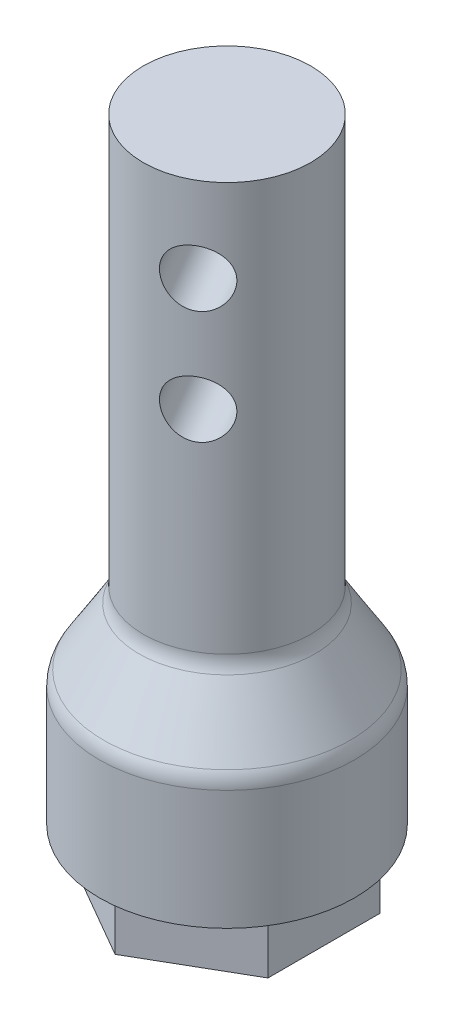
ISO-10303-21;
HEADER;
FILE_DESCRIPTION(('STEP AP214'),'2;1');
FILE_NAME('part.step','',(''),(''),'','','');
FILE_SCHEMA(('AUTOMOTIVE_DESIGN { 1 0 10303 214 1 1 1 1 }'));
ENDSEC;
DATA;
#1=APPLICATION_CONTEXT('core data for automotive mechanical design processes');
#2=APPLICATION_PROTOCOL_DEFINITION('international standard','automotive_design',2000,#1);
#3=PRODUCT_CONTEXT('',#1,'mechanical');
#4=PRODUCT('Part','Part','',(#3));
#5=PRODUCT_RELATED_PRODUCT_CATEGORY('part','',(#4));
#6=PRODUCT_DEFINITION_FORMATION('','',#4);
#7=PRODUCT_DEFINITION_CONTEXT('part definition',#1,'design');
#8=PRODUCT_DEFINITION('design','',#6,#7);
#9=PRODUCT_DEFINITION_SHAPE('','',#8);
#10=(LENGTH_UNIT() NAMED_UNIT(*) SI_UNIT(.MILLI.,.METRE.));
#11=(NAMED_UNIT(*) PLANE_ANGLE_UNIT() SI_UNIT($,.RADIAN.));
#12=(NAMED_UNIT(*) SI_UNIT($,.STERADIAN.) SOLID_ANGLE_UNIT());
#13=UNCERTAINTY_MEASURE_WITH_UNIT(LENGTH_MEASURE(1.E-05),#10,'distance_accuracy_value','');
#14=(GEOMETRIC_REPRESENTATION_CONTEXT(3) GLOBAL_UNCERTAINTY_ASSIGNED_CONTEXT((#13)) GLOBAL_UNIT_ASSIGNED_CONTEXT((#10,
#11,#12)) REPRESENTATION_CONTEXT('',''));
#15=CARTESIAN_POINT('',(0.,0.,0.));
#16=DIRECTION('',(0.,0.,1.));
#17=DIRECTION('',(1.,0.,0.));
#18=AXIS2_PLACEMENT_3D('',#15,#16,#17);
#19=CARTESIAN_POINT('',(0.,31.7,0.));
#20=DIRECTION('',(0.,1.,0.));
#21=DIRECTION('',(-1.,0.,0.));
#22=AXIS2_PLACEMENT_3D('',#19,#20,#21);
#23=CYLINDRICAL_SURFACE('',#22,2.955);
#24=CARTESIAN_POINT('',(0.,9.2840657540408,0.));
#25=DIRECTION('',(0.,1.,0.));
#26=DIRECTION('',(-1.,0.,0.));
#27=AXIS2_PLACEMENT_3D('',#24,#25,#26);
#28=CIRCLE('',#27,2.955);
#29=CARTESIAN_POINT('',(-2.955,9.2840657540408,0.));
#30=VERTEX_POINT('',#29);
#31=EDGE_CURVE('E172',#30,#30,#28,.T.);
#32=ORIENTED_EDGE('',*,*,#31,.T.);
#33=EDGE_LOOP('',(#32));
#34=FACE_BOUND('',#33,.T.);
#35=CARTESIAN_POINT('',(-2.25635135477579,16.7,-1.90811518619853));
#36=CARTESIAN_POINT('',(-2.25635156306348,16.6455850715898,-1.90811467938033));
#37=CARTESIAN_POINT('',(-2.25329930267321,16.5911730465001,-1.91174181547357));
#38=CARTESIAN_POINT('',(-2.24114168311384,16.4839643787809,-1.92597889399212));
#39=CARTESIAN_POINT('',(-2.23203547955401,16.4311679625678,-1.93658981049777));
#40=CARTESIAN_POINT('',(-2.20792755708891,16.3287616258257,-1.96402914650382));
#41=CARTESIAN_POINT('',(-2.19293767981311,16.279145536382,-1.98084507359685));
#42=CARTESIAN_POINT('',(-2.15723547191955,16.1841895138214,-2.01966658735976));
#43=CARTESIAN_POINT('',(-2.13652181901097,16.1388505720498,-2.04167337303524));
#44=CARTESIAN_POINT('',(-2.08870703216197,16.0519068175812,-2.0905829679948));
#45=CARTESIAN_POINT('',(-2.06139971363851,16.010499625433,-2.11763559345612));
#46=CARTESIAN_POINT('',(-2.00111649437055,15.9343720324557,-2.17469035630231));
#47=CARTESIAN_POINT('',(-1.96813965323523,15.8996527429627,-2.20469298264314));
#48=CARTESIAN_POINT('',(-1.89595107498425,15.8369834975132,-2.26709684456123));
#49=CARTESIAN_POINT('',(-1.8565950988765,15.8092415015202,-2.29954095964332));
#50=CARTESIAN_POINT('',(-1.77301904399229,15.7626921194016,-2.36457751843322));
#51=CARTESIAN_POINT('',(-1.72880032321696,15.7438822465986,-2.397169918305));
#52=CARTESIAN_POINT('',(-1.63819679476514,15.7164038499222,-2.45993152963247));
#53=CARTESIAN_POINT('',(-1.59194607278008,15.7073965921692,-2.49014571726024));
#54=CARTESIAN_POINT('',(-1.4971722809998,15.6987010950361,-2.54825162693849));
#55=CARTESIAN_POINT('',(-1.44864981788537,15.6990103816364,-2.57614396358648));
#56=CARTESIAN_POINT('',(-1.3528294452991,15.7087263731235,-2.62768334598744));
#57=CARTESIAN_POINT('',(-1.30556128375458,15.7177649581017,-2.65145639406974));
#58=CARTESIAN_POINT('',(-1.21174821706988,15.7440730046434,-2.69562251666027));
#59=CARTESIAN_POINT('',(-1.16520336154294,15.7613430282695,-2.71601536023177));
#60=CARTESIAN_POINT('',(-1.07362840637936,15.8038333537394,-2.75351229832194));
#61=CARTESIAN_POINT('',(-1.02862681413201,15.829156686886,-2.77056886739878));
#62=CARTESIAN_POINT('',(-0.94215022461664,15.8869492299422,-2.80115778289188));
#63=CARTESIAN_POINT('',(-0.900676233459607,15.9194204691022,-2.8146891261296));
#64=CARTESIAN_POINT('',(-0.820625820787402,15.9924329364908,-2.83909043260758));
#65=CARTESIAN_POINT('',(-0.782287027757659,16.0332888508016,-2.84979975448407));
#66=CARTESIAN_POINT('',(-0.712247825503682,16.1209684627991,-2.86810769260798));
#67=CARTESIAN_POINT('',(-0.680548505851158,16.1677931379652,-2.87570579848393));
#68=CARTESIAN_POINT('',(-0.624667272439573,16.2670130848329,-2.88836499032849));
#69=CARTESIAN_POINT('',(-0.600606024298998,16.3194817592724,-2.89338605932651));
#70=CARTESIAN_POINT('',(-0.561871468846894,16.4279318160076,-2.90115845136481));
#71=CARTESIAN_POINT('',(-0.547194081833177,16.4839116601568,-2.90391076091561));
#72=CARTESIAN_POINT('',(-0.528500129990101,16.5950164415408,-2.90736983015634));
#73=CARTESIAN_POINT('',(-0.524021101888699,16.650060803426,-2.90816546242258));
#74=CARTESIAN_POINT('',(-0.524606937896373,16.7600909147996,-2.90806005194184));
#75=CARTESIAN_POINT('',(-0.529669999609514,16.8150766733947,-2.90715932961762));
#76=CARTESIAN_POINT('',(-0.548698751951318,16.9213760743047,-2.90362557577604));
#77=CARTESIAN_POINT('',(-0.562339398844837,16.9727507109754,-2.9010556844164));
#78=CARTESIAN_POINT('',(-0.597555464460793,17.0725612975861,-2.89400634361763));
#79=CARTESIAN_POINT('',(-0.619132316822139,17.1209967147268,-2.88952654914003));
#80=CARTESIAN_POINT('',(-0.670123479912287,17.2152963758468,-2.87813502329083));
#81=CARTESIAN_POINT('',(-0.699769384444346,17.2610261926209,-2.87114909654101));
#82=CARTESIAN_POINT('',(-0.765406649655556,17.3471029879932,-2.8543516840044));
#83=CARTESIAN_POINT('',(-0.801399935563742,17.3874483268802,-2.84453934036139));
#84=CARTESIAN_POINT('',(-0.880444365161057,17.4636898008177,-2.82110302790222));
#85=CARTESIAN_POINT('',(-0.923757837382075,17.4992640342464,-2.80731348372906));
#86=CARTESIAN_POINT('',(-1.01455002936716,17.5624789391855,-2.77579162132625));
#87=CARTESIAN_POINT('',(-1.06202861499433,17.5901198660647,-2.75805943004078));
#88=CARTESIAN_POINT('',(-1.15923318087854,17.6364359535437,-2.71862717646676));
#89=CARTESIAN_POINT('',(-1.20894288227901,17.655167214446,-2.69695316257323));
#90=CARTESIAN_POINT('',(-1.30917383048714,17.6832209880047,-2.649745653095));
#91=CARTESIAN_POINT('',(-1.35969476716976,17.6925470130814,-2.62421360240747));
#92=CARTESIAN_POINT('',(-1.45739266079324,17.7012018761237,-2.57118106737305));
#93=CARTESIAN_POINT('',(-1.50461320982076,17.7009921902695,-2.54383540161145));
#94=CARTESIAN_POINT('',(-1.59682802659983,17.6917256013688,-2.48698582928021));
#95=CARTESIAN_POINT('',(-1.64182248404432,17.6826694535289,-2.45748210713884));
#96=CARTESIAN_POINT('',(-1.72768573117701,17.6562757784119,-2.39787730873398));
#97=CARTESIAN_POINT('',(-1.76861111191251,17.6390798655607,-2.36779458242961));
#98=CARTESIAN_POINT('',(-1.84635616139078,17.5970269006304,-2.30768524474045));
#99=CARTESIAN_POINT('',(-1.88317507851925,17.572168449185,-2.2776586446142));
#100=CARTESIAN_POINT('',(-1.95343423164802,17.5144200827864,-2.21773144200151));
#101=CARTESIAN_POINT('',(-1.98669508764173,17.4812630396545,-2.18787813934178));
#102=CARTESIAN_POINT('',(-2.04777652585373,17.4083090356641,-2.13081828458477));
#103=CARTESIAN_POINT('',(-2.0755953391814,17.3685099236203,-2.10361259451106));
#104=CARTESIAN_POINT('',(-2.12652794725262,17.2814660804914,-2.05213789747355));
#105=CARTESIAN_POINT('',(-2.14940419070634,17.2339842543603,-2.02803346131877));
#106=CARTESIAN_POINT('',(-2.18870687791636,17.1340443781594,-1.98555500240144));
#107=CARTESIAN_POINT('',(-2.20513475939784,17.0815874405815,-1.96717970246026));
#108=CARTESIAN_POINT('',(-2.23087498215111,16.9750359477371,-1.93793461824992));
#109=CARTESIAN_POINT('',(-2.24041632489682,16.9210630415861,-1.92682456547873));
#110=CARTESIAN_POINT('',(-2.25315321758512,16.8113919742203,-1.91191647658401));
#111=CARTESIAN_POINT('',(-2.25635114159033,16.7556944663772,-1.9081157049343));
#112=CARTESIAN_POINT('',(-2.25635135477579,16.7,-1.90811518619853));
#113=B_SPLINE_CURVE_WITH_KNOTS('',3,(#35,#36,#37,#38,#39,#40,#41,#42,#43,#44,#45,#46,#47,#48,
#49,#50,#51,#52,#53,#54,#55,#56,#57,#58,#59,#60,#61,#62,#63,#64,#65,#66,#67,#68,#69,#70,#71,#72,
#73,#74,#75,#76,#77,#78,#79,#80,#81,#82,#83,#84,#85,#86,#87,#88,#89,#90,#91,#92,#93,#94,#95,#96,
#97,#98,#99,#100,#101,#102,#103,#104,#105,#106,#107,#108,#109,#110,#111,#112),.UNSPECIFIED.,.T.,
.F.,(4,2,2,2,2,2,2,2,2,2,2,2,2,2,2,2,2,2,2,2,2,2,2,2,2,2,2,2,2,2,2,2,2,2,2,2,2,2,4),(0.,
0.163038404659592,0.326099554331134,0.488834192081306,0.651606455812419,0.820341195895891,
0.989103950676485,1.16242090997189,1.33568958999521,1.50275956429446,1.66978517335194,
1.83006149395738,1.99034876018666,2.15277528345798,2.31524797831214,2.48558977551977,
2.65595950482787,2.82890030980835,3.00176587629034,3.16662161580142,3.33144621899538,
3.49037293715144,3.64932837879756,3.81344164693925,3.97760477828403,4.14994852966303,
4.32228673277177,4.49352494151021,4.66469917699631,4.82759875967053,4.99048443711566,
5.15063493961219,5.31081470683897,5.47702474800598,5.64328872492141,5.81631905996031,
5.98931079425552,6.15624544798233,6.32311761361418),.UNSPECIFIED.);
#114=CARTESIAN_POINT('',(-2.25635135477579,16.7,-1.90811518619853));
#115=VERTEX_POINT('',#114);
#116=EDGE_CURVE('E51',#115,#115,#113,.T.);
#117=ORIENTED_EDGE('',*,*,#116,.T.);
#118=EDGE_LOOP('',(#117));
#119=FACE_BOUND('',#118,.T.);
#120=CARTESIAN_POINT('',(0.524300547206911,16.7,2.90811518619854));
#121=CARTESIAN_POINT('',(0.524300004145622,16.7544149284102,2.90811511317186));
#122=CARTESIAN_POINT('',(0.528967326340489,16.8088269534999,2.90728534618154));
#123=CARTESIAN_POINT('',(0.547375807792913,16.9160356212191,2.90387507805286));
#124=CARTESIAN_POINT('',(0.561118232824157,16.9688320374322,2.90129433269084));
#125=CARTESIAN_POINT('',(0.596935356100926,17.0712383741743,2.89413592740663));
#126=CARTESIAN_POINT('',(0.618993314789575,17.120854463618,2.88956227643269));
#127=CARTESIAN_POINT('',(0.670464835868407,17.2158104861786,2.87805401430712));
#128=CARTESIAN_POINT('',(0.699880097773302,17.2611494279502,2.87111885752086));
#129=CARTESIAN_POINT('',(0.766144442921585,17.3480931824188,2.85416483491287));
#130=CARTESIAN_POINT('',(0.803226363071882,17.3895003745669,2.84404231609298));
#131=CARTESIAN_POINT('',(0.882778846737561,17.4656279675443,2.82036289820812));
#132=CARTESIAN_POINT('',(0.925250303896631,17.5003472570373,2.80680542921877));
#133=CARTESIAN_POINT('',(1.01538792273744,17.5630165024868,2.77549021754939));
#134=CARTESIAN_POINT('',(1.06316333865571,17.5907584984798,2.75762899999038));
#135=CARTESIAN_POINT('',(1.16127467818459,17.6373078805984,2.71776829270753));
#136=CARTESIAN_POINT('',(1.21160988483152,17.6561177534014,2.69576995712913));
#137=CARTESIAN_POINT('',(1.31126479884946,17.6835961500778,2.64868580548108));
#138=CARTESIAN_POINT('',(1.36055641388235,17.6926034078308,2.62373859911254));
#139=CARTESIAN_POINT('',(1.45826450366386,17.7012989049639,2.57071504265697));
#140=CARTESIAN_POINT('',(1.50668120732914,17.7009896183636,2.54263952526967));
#141=CARTESIAN_POINT('',(1.59922580807687,17.6912736268765,2.48542633961035));
#142=CARTESIAN_POINT('',(1.64344795241379,17.6822350418983,2.45637743496376));
#143=CARTESIAN_POINT('',(1.72860346990619,17.6559269953566,2.39721599730315));
#144=CARTESIAN_POINT('',(1.76953661825799,17.6386569717305,2.36710339178709));
#145=CARTESIAN_POINT('',(1.84779739679,17.5961666462606,2.3065456233101));
#146=CARTESIAN_POINT('',(1.88506961503562,17.570843313114,2.27610138575156));
#147=CARTESIAN_POINT('',(1.95479868768454,17.5130507700578,2.21650492014516));
#148=CARTESIAN_POINT('',(1.98725417025426,17.4805795308978,2.1873530618257));
#149=CARTESIAN_POINT('',(2.04841152788582,17.4075670635092,2.13022802410714));
#150=CARTESIAN_POINT('',(2.07685546920303,17.3667111491984,2.10238031633119));
#151=CARTESIAN_POINT('',(2.12773020983624,17.2790315372009,2.0508785569804));
#152=CARTESIAN_POINT('',(2.15016002237172,17.2322068620348,2.02722519381661));
#153=CARTESIAN_POINT('',(2.18906382080628,17.1329869151671,1.98516022200965));
#154=CARTESIAN_POINT('',(2.20544281818301,17.0805182407276,1.96683310437216));
#155=CARTESIAN_POINT('',(2.2315411848624,16.9720681839924,1.93717419136549));
#156=CARTESIAN_POINT('',(2.24126344835933,16.9160883398432,1.92583935612584));
#157=CARTESIAN_POINT('',(2.25360606611679,16.8049835584592,1.91137945355297));
#158=CARTESIAN_POINT('',(2.25653461792213,16.749939196574,1.90789831756602));
#159=CARTESIAN_POINT('',(2.25615041176414,16.6399090852004,1.90835296119074));
#160=CARTESIAN_POINT('',(2.25283883249304,16.5849233266053,1.91228734009314));
#161=CARTESIAN_POINT('',(2.24026413572461,16.4786239256953,1.92699984610267));
#162=CARTESIAN_POINT('',(2.23121822107544,16.4272492890246,1.9375280471567));
#163=CARTESIAN_POINT('',(2.20750528005579,16.3274387024139,1.96450138420207));
#164=CARTESIAN_POINT('',(2.19283723805378,16.2790032852731,1.9809475892419));
#165=CARTESIAN_POINT('',(2.15747630573543,16.1847036241532,2.01941146892188));
#166=CARTESIAN_POINT('',(2.13660336343508,16.1389738073791,2.04159261198991));
#167=CARTESIAN_POINT('',(2.08923774485492,16.0528970120068,2.09003744482945));
#168=CARTESIAN_POINT('',(2.06274336303532,16.0125516731198,2.1163023729701));
#169=CARTESIAN_POINT('',(2.002924706276,15.9363101991823,2.17303870079945));
#170=CARTESIAN_POINT('',(1.96932587460492,15.9007359657536,2.20365449598238));
#171=CARTESIAN_POINT('',(1.89663104499695,15.8375210608145,2.26652190950533));
#172=CARTESIAN_POINT('',(1.85753522406538,15.8098801339353,2.29877347515148));
#173=CARTESIAN_POINT('',(1.77478360779971,15.7635640464563,2.36323897178404));
#174=CARTESIAN_POINT('',(1.7311585104657,15.744832785554,2.39545182906462));
#175=CARTESIAN_POINT('',(1.64016013390409,15.7167790119953,2.45865062171914));
#176=CARTESIAN_POINT('',(1.59278826105666,15.7074529869186,2.48963701096552));
#177=CARTESIAN_POINT('',(1.49801179167803,15.6987981238763,2.54772960122246));
#178=CARTESIAN_POINT('',(1.45071947593133,15.6990078097305,2.57495096338015));
#179=CARTESIAN_POINT('',(1.35537889370866,15.7082743986312,2.62638655115053));
#180=CARTESIAN_POINT('',(1.30733069210579,15.7173305464711,2.65060103325627));
#181=CARTESIAN_POINT('',(1.21277979893339,15.7437242215881,2.69515838732217));
#182=CARTESIAN_POINT('',(1.16626470337096,15.7609201344393,2.71555944354648));
#183=CARTESIAN_POINT('',(1.07533596518835,15.8029730993696,2.75283396256856));
#184=CARTESIAN_POINT('',(1.03092270812551,15.827831550815,2.76970678007852));
#185=CARTESIAN_POINT('',(0.943894651720802,15.8855799172136,2.80058939023007));
#186=CARTESIAN_POINT('',(0.90141050523375,15.9187369603455,2.81446748514238));
#187=CARTESIAN_POINT('',(0.821454502371925,15.9916909643359,2.83883563495515));
#188=CARTESIAN_POINT('',(0.783984276976776,16.0314900763797,2.8493245889632));
#189=CARTESIAN_POINT('',(0.71393957765457,16.1185339195086,2.86769617291512));
#190=CARTESIAN_POINT('',(0.681626401873768,16.1660157456397,2.87545536281181));
#191=CARTESIAN_POINT('',(0.625187633732745,16.2659556218406,2.88825325891401));
#192=CARTESIAN_POINT('',(0.601060216440783,16.3184125594185,2.89329257163674));
#193=CARTESIAN_POINT('',(0.562863119202173,16.4249640522629,2.90096171633498));
#194=CARTESIAN_POINT('',(0.548470859892082,16.4789369584139,2.90366973515338));
#195=CARTESIAN_POINT('',(0.529191629843233,16.5886080257797,2.90724616333936));
#196=CARTESIAN_POINT('',(0.524301103037996,16.6443055336228,2.90811526094239));
#197=CARTESIAN_POINT('',(0.524300547206911,16.7,2.90811518619854));
#198=B_SPLINE_CURVE_WITH_KNOTS('',3,(#120,#121,#122,#123,#124,#125,#126,#127,#128,#129,#130,
#131,#132,#133,#134,#135,#136,#137,#138,#139,#140,#141,#142,#143,#144,#145,#146,#147,#148,#149,
#150,#151,#152,#153,#154,#155,#156,#157,#158,#159,#160,#161,#162,#163,#164,#165,#166,#167,#168,
#169,#170,#171,#172,#173,#174,#175,#176,#177,#178,#179,#180,#181,#182,#183,#184,#185,#186,#187,
#188,#189,#190,#191,#192,#193,#194,#195,#196,#197),.UNSPECIFIED.,.T.,.F.,(4,2,2,2,2,2,2,2,2,2,2,
2,2,2,2,2,2,2,2,2,2,2,2,2,2,2,2,2,2,2,2,2,2,2,2,2,2,2,4),(0.,0.163038404659592,
0.326099554331134,0.488834192081306,0.651606455812419,0.820341195895891,0.989103950676485,
1.16242090997189,1.33568958999521,1.50275956429446,1.66978517335194,1.83006149395738,
1.99034876018667,2.15277528345799,2.31524797831214,2.48558977551977,2.65595950482787,
2.82890030980835,3.00176587629034,3.16662161580142,3.33144621899538,3.49037293715144,
3.64932837879756,3.81344164693926,3.97760477828403,4.14994852966303,4.32228673277177,
4.4935249415102,4.66469917699631,4.82759875967053,4.99048443711566,5.15063493961219,
5.31081470683897,5.47702474800598,5.64328872492141,5.81631905996031,5.98931079425552,
6.15624544798233,6.32311761361418),.UNSPECIFIED.);
#199=CARTESIAN_POINT('',(0.524300547206911,16.7,2.90811518619854));
#200=VERTEX_POINT('',#199);
#201=EDGE_CURVE('E116',#200,#200,#198,.T.);
#202=ORIENTED_EDGE('',*,*,#201,.T.);
#203=EDGE_LOOP('',(#202));
#204=FACE_BOUND('',#203,.T.);
#205=CARTESIAN_POINT('',(-2.25635135477579,20.7,-1.90811518619853));
#206=CARTESIAN_POINT('',(-2.25635156306348,20.6455850715898,-1.90811467938033));
#207=CARTESIAN_POINT('',(-2.25329930267321,20.5911730465001,-1.91174181547357));
#208=CARTESIAN_POINT('',(-2.24114168311384,20.4839643787809,-1.92597889399212));
#209=CARTESIAN_POINT('',(-2.23203547955401,20.4311679625678,-1.93658981049777));
#210=CARTESIAN_POINT('',(-2.20792755708891,20.3287616258257,-1.96402914650382));
#211=CARTESIAN_POINT('',(-2.19293767981311,20.279145536382,-1.98084507359685));
#212=CARTESIAN_POINT('',(-2.15723547191955,20.1841895138214,-2.01966658735976));
#213=CARTESIAN_POINT('',(-2.13652181901097,20.1388505720498,-2.04167337303524));
#214=CARTESIAN_POINT('',(-2.08870703216197,20.0519068175812,-2.0905829679948));
#215=CARTESIAN_POINT('',(-2.06139971363851,20.010499625433,-2.11763559345612));
#216=CARTESIAN_POINT('',(-2.00111649437055,19.9343720324557,-2.17469035630231));
#217=CARTESIAN_POINT('',(-1.96813965323523,19.8996527429627,-2.20469298264314));
#218=CARTESIAN_POINT('',(-1.89595107498425,19.8369834975132,-2.26709684456123));
#219=CARTESIAN_POINT('',(-1.85659509887649,19.8092415015202,-2.29954095964332));
#220=CARTESIAN_POINT('',(-1.77301904399229,19.7626921194016,-2.36457751843322));
#221=CARTESIAN_POINT('',(-1.72880032321695,19.7438822465986,-2.397169918305));
#222=CARTESIAN_POINT('',(-1.63819679476514,19.7164038499222,-2.45993152963247));
#223=CARTESIAN_POINT('',(-1.59194607278008,19.7073965921692,-2.49014571726024));
#224=CARTESIAN_POINT('',(-1.4971722809998,19.6987010950361,-2.54825162693849));
#225=CARTESIAN_POINT('',(-1.44864981788538,19.6990103816364,-2.57614396358648));
#226=CARTESIAN_POINT('',(-1.3528294452991,19.7087263731235,-2.62768334598744));
#227=CARTESIAN_POINT('',(-1.30556128375458,19.7177649581017,-2.65145639406974));
#228=CARTESIAN_POINT('',(-1.21174821706988,19.7440730046434,-2.69562251666027));
#229=CARTESIAN_POINT('',(-1.16520336154294,19.7613430282695,-2.71601536023177));
#230=CARTESIAN_POINT('',(-1.07362840637936,19.8038333537394,-2.75351229832194));
#231=CARTESIAN_POINT('',(-1.02862681413201,19.829156686886,-2.77056886739878));
#232=CARTESIAN_POINT('',(-0.942150224616641,19.8869492299422,-2.80115778289188));
#233=CARTESIAN_POINT('',(-0.900676233459608,19.9194204691022,-2.8146891261296));
#234=CARTESIAN_POINT('',(-0.820625820787403,19.9924329364908,-2.83909043260758));
#235=CARTESIAN_POINT('',(-0.782287027757658,20.0332888508016,-2.84979975448407));
#236=CARTESIAN_POINT('',(-0.71224782550368,20.1209684627991,-2.86810769260798));
#237=CARTESIAN_POINT('',(-0.680548505851158,20.1677931379652,-2.87570579848393));
#238=CARTESIAN_POINT('',(-0.624667272439572,20.2670130848329,-2.88836499032849));
#239=CARTESIAN_POINT('',(-0.600606024298996,20.3194817592724,-2.89338605932651));
#240=CARTESIAN_POINT('',(-0.561871468846892,20.4279318160076,-2.90115845136481));
#241=CARTESIAN_POINT('',(-0.547194081833176,20.4839116601568,-2.90391076091561));
#242=CARTESIAN_POINT('',(-0.5285001299901,20.5950164415408,-2.90736983015634));
#243=CARTESIAN_POINT('',(-0.5240211018887,20.650060803426,-2.90816546242258));
#244=CARTESIAN_POINT('',(-0.524606937896372,20.7600909147996,-2.90806005194184));
#245=CARTESIAN_POINT('',(-0.529669999609513,20.8150766733947,-2.90715932961762));
#246=CARTESIAN_POINT('',(-0.548698751951315,20.9213760743046,-2.90362557577604));
#247=CARTESIAN_POINT('',(-0.562339398844835,20.9727507109754,-2.9010556844164));
#248=CARTESIAN_POINT('',(-0.597555464460791,21.0725612975861,-2.89400634361763));
#249=CARTESIAN_POINT('',(-0.619132316822137,21.1209967147268,-2.88952654914003));
#250=CARTESIAN_POINT('',(-0.670123479912286,21.2152963758468,-2.87813502329083));
#251=CARTESIAN_POINT('',(-0.699769384444347,21.2610261926209,-2.87114909654101));
#252=CARTESIAN_POINT('',(-0.765406649655556,21.3471029879932,-2.8543516840044));
#253=CARTESIAN_POINT('',(-0.80139993556374,21.3874483268802,-2.84453934036139));
#254=CARTESIAN_POINT('',(-0.880444365161056,21.4636898008177,-2.82110302790222));
#255=CARTESIAN_POINT('',(-0.923757837382075,21.4992640342464,-2.80731348372906));
#256=CARTESIAN_POINT('',(-1.01455002936716,21.5624789391855,-2.77579162132625));
#257=CARTESIAN_POINT('',(-1.06202861499433,21.5901198660647,-2.75805943004078));
#258=CARTESIAN_POINT('',(-1.15923318087854,21.6364359535437,-2.71862717646676));
#259=CARTESIAN_POINT('',(-1.20894288227901,21.655167214446,-2.69695316257323));
#260=CARTESIAN_POINT('',(-1.30917383048714,21.6832209880047,-2.649745653095));
#261=CARTESIAN_POINT('',(-1.35969476716976,21.6925470130814,-2.62421360240747));
#262=CARTESIAN_POINT('',(-1.45739266079324,21.7012018761237,-2.57118106737305));
#263=CARTESIAN_POINT('',(-1.50461320982076,21.7009921902695,-2.54383540161146));
#264=CARTESIAN_POINT('',(-1.59682802659983,21.6917256013688,-2.48698582928021));
#265=CARTESIAN_POINT('',(-1.64182248404432,21.6826694535289,-2.45748210713884));
#266=CARTESIAN_POINT('',(-1.72768573117701,21.6562757784119,-2.39787730873399));
#267=CARTESIAN_POINT('',(-1.7686111119125,21.6390798655607,-2.36779458242961));
#268=CARTESIAN_POINT('',(-1.84635616139077,21.5970269006304,-2.30768524474045));
#269=CARTESIAN_POINT('',(-1.88317507851925,21.572168449185,-2.2776586446142));
#270=CARTESIAN_POINT('',(-1.95343423164801,21.5144200827864,-2.21773144200152));
#271=CARTESIAN_POINT('',(-1.98669508764173,21.4812630396545,-2.18787813934178));
#272=CARTESIAN_POINT('',(-2.04777652585373,21.4083090356641,-2.13081828458477));
#273=CARTESIAN_POINT('',(-2.0755953391814,21.3685099236203,-2.10361259451106));
#274=CARTESIAN_POINT('',(-2.12652794725262,21.2814660804914,-2.05213789747355));
#275=CARTESIAN_POINT('',(-2.14940419070634,21.2339842543603,-2.02803346131877));
#276=CARTESIAN_POINT('',(-2.18870687791636,21.1340443781594,-1.98555500240144));
#277=CARTESIAN_POINT('',(-2.20513475939784,21.0815874405815,-1.96717970246026));
#278=CARTESIAN_POINT('',(-2.23087498215111,20.9750359477371,-1.93793461824992));
#279=CARTESIAN_POINT('',(-2.24041632489682,20.9210630415861,-1.92682456547873));
#280=CARTESIAN_POINT('',(-2.25315321758511,20.8113919742203,-1.91191647658401));
#281=CARTESIAN_POINT('',(-2.25635114159033,20.7556944663772,-1.9081157049343));
#282=CARTESIAN_POINT('',(-2.25635135477579,20.7,-1.90811518619853));
#283=B_SPLINE_CURVE_WITH_KNOTS('',3,(#205,#206,#207,#208,#209,#210,#211,#212,#213,#214,#215,
#216,#217,#218,#219,#220,#221,#222,#223,#224,#225,#226,#227,#228,#229,#230,#231,#232,#233,#234,
#235,#236,#237,#238,#239,#240,#241,#242,#243,#244,#245,#246,#247,#248,#249,#250,#251,#252,#253,
#254,#255,#256,#257,#258,#259,#260,#261,#262,#263,#264,#265,#266,#267,#268,#269,#270,#271,#272,
#273,#274,#275,#276,#277,#278,#279,#280,#281,#282),.UNSPECIFIED.,.T.,.F.,(4,2,2,2,2,2,2,2,2,2,2,
2,2,2,2,2,2,2,2,2,2,2,2,2,2,2,2,2,2,2,2,2,2,2,2,2,2,2,4),(0.,0.163038404659595,
0.326099554331134,0.488834192081306,0.651606455812419,0.820341195895894,0.989103950676485,
1.16242090997189,1.33568958999521,1.50275956429446,1.66978517335194,1.83006149395738,
1.99034876018667,2.15277528345798,2.31524797831214,2.48558977551977,2.65595950482787,
2.82890030980836,3.00176587629035,3.16662161580142,3.33144621899538,3.49037293715144,
3.64932837879756,3.81344164693926,3.97760477828403,4.14994852966303,4.32228673277177,
4.4935249415102,4.66469917699631,4.82759875967053,4.99048443711566,5.15063493961219,
5.31081470683898,5.47702474800598,5.64328872492141,5.81631905996031,5.98931079425552,
6.15624544798233,6.32311761361418),.UNSPECIFIED.);
#284=CARTESIAN_POINT('',(-2.25635135477579,20.7,-1.90811518619853));
#285=VERTEX_POINT('',#284);
#286=EDGE_CURVE('E12',#285,#285,#283,.T.);
#287=ORIENTED_EDGE('',*,*,#286,.T.);
#288=EDGE_LOOP('',(#287));
#289=FACE_BOUND('',#288,.T.);
#290=CARTESIAN_POINT('',(0.524300547206911,20.7,2.90811518619854));
#291=CARTESIAN_POINT('',(0.524300004145622,20.7544149284102,2.90811511317186));
#292=CARTESIAN_POINT('',(0.528967326340489,20.8088269534999,2.90728534618154));
#293=CARTESIAN_POINT('',(0.547375807792914,20.9160356212191,2.90387507805286));
#294=CARTESIAN_POINT('',(0.561118232824158,20.9688320374322,2.90129433269084));
#295=CARTESIAN_POINT('',(0.596935356100927,21.0712383741743,2.89413592740663));
#296=CARTESIAN_POINT('',(0.618993314789575,21.120854463618,2.88956227643269));
#297=CARTESIAN_POINT('',(0.670464835868407,21.2158104861786,2.87805401430712));
#298=CARTESIAN_POINT('',(0.699880097773302,21.2611494279502,2.87111885752086));
#299=CARTESIAN_POINT('',(0.766144442921585,21.3480931824188,2.85416483491287));
#300=CARTESIAN_POINT('',(0.803226363071883,21.389500374567,2.84404231609298));
#301=CARTESIAN_POINT('',(0.882778846737562,21.4656279675443,2.82036289820812));
#302=CARTESIAN_POINT('',(0.925250303896631,21.5003472570373,2.80680542921877));
#303=CARTESIAN_POINT('',(1.01538792273744,21.5630165024868,2.77549021754939));
#304=CARTESIAN_POINT('',(1.06316333865571,21.5907584984798,2.75762899999038));
#305=CARTESIAN_POINT('',(1.16127467818459,21.6373078805984,2.71776829270753));
#306=CARTESIAN_POINT('',(1.21160988483152,21.6561177534014,2.69576995712913));
#307=CARTESIAN_POINT('',(1.31126479884946,21.6835961500778,2.64868580548108));
#308=CARTESIAN_POINT('',(1.36055641388235,21.6926034078308,2.62373859911254));
#309=CARTESIAN_POINT('',(1.45826450366386,21.7012989049639,2.57071504265697));
#310=CARTESIAN_POINT('',(1.50668120732914,21.7009896183636,2.54263952526967));
#311=CARTESIAN_POINT('',(1.59922580807687,21.6912736268765,2.48542633961035));
#312=CARTESIAN_POINT('',(1.64344795241379,21.6822350418983,2.45637743496376));
#313=CARTESIAN_POINT('',(1.72860346990619,21.6559269953566,2.39721599730315));
#314=CARTESIAN_POINT('',(1.76953661825799,21.6386569717305,2.36710339178709));
#315=CARTESIAN_POINT('',(1.84779739679,21.5961666462606,2.3065456233101));
#316=CARTESIAN_POINT('',(1.88506961503562,21.570843313114,2.27610138575156));
#317=CARTESIAN_POINT('',(1.95479868768455,21.5130507700578,2.21650492014516));
#318=CARTESIAN_POINT('',(1.98725417025426,21.4805795308978,2.1873530618257));
#319=CARTESIAN_POINT('',(2.04841152788582,21.4075670635092,2.13022802410714));
#320=CARTESIAN_POINT('',(2.07685546920303,21.3667111491984,2.10238031633119));
#321=CARTESIAN_POINT('',(2.12773020983624,21.2790315372009,2.0508785569804));
#322=CARTESIAN_POINT('',(2.15016002237172,21.2322068620348,2.02722519381661));
#323=CARTESIAN_POINT('',(2.18906382080628,21.1329869151671,1.98516022200965));
#324=CARTESIAN_POINT('',(2.20544281818301,21.0805182407276,1.96683310437216));
#325=CARTESIAN_POINT('',(2.2315411848624,20.9720681839924,1.93717419136549));
#326=CARTESIAN_POINT('',(2.24126344835933,20.9160883398432,1.92583935612584));
#327=CARTESIAN_POINT('',(2.25360606611679,20.8049835584592,1.91137945355297));
#328=CARTESIAN_POINT('',(2.25653461792213,20.749939196574,1.90789831756602));
#329=CARTESIAN_POINT('',(2.25615041176414,20.6399090852004,1.90835296119074));
#330=CARTESIAN_POINT('',(2.25283883249304,20.5849233266053,1.91228734009314));
#331=CARTESIAN_POINT('',(2.24026413572461,20.4786239256953,1.92699984610267));
#332=CARTESIAN_POINT('',(2.23121822107544,20.4272492890246,1.9375280471567));
#333=CARTESIAN_POINT('',(2.20750528005579,20.3274387024139,1.96450138420207));
#334=CARTESIAN_POINT('',(2.19283723805378,20.2790032852732,1.9809475892419));
#335=CARTESIAN_POINT('',(2.15747630573543,20.1847036241532,2.01941146892188));
#336=CARTESIAN_POINT('',(2.13660336343508,20.1389738073791,2.04159261198991));
#337=CARTESIAN_POINT('',(2.08923774485492,20.0528970120068,2.09003744482944));
#338=CARTESIAN_POINT('',(2.06274336303532,20.0125516731198,2.1163023729701));
#339=CARTESIAN_POINT('',(2.002924706276,19.9363101991823,2.17303870079945));
#340=CARTESIAN_POINT('',(1.96932587460492,19.9007359657536,2.20365449598238));
#341=CARTESIAN_POINT('',(1.89663104499695,19.8375210608145,2.26652190950533));
#342=CARTESIAN_POINT('',(1.85753522406538,19.8098801339353,2.29877347515148));
#343=CARTESIAN_POINT('',(1.77478360779971,19.7635640464563,2.36323897178404));
#344=CARTESIAN_POINT('',(1.7311585104657,19.744832785554,2.39545182906462));
#345=CARTESIAN_POINT('',(1.64016013390409,19.7167790119953,2.45865062171914));
#346=CARTESIAN_POINT('',(1.59278826105667,19.7074529869186,2.48963701096551));
#347=CARTESIAN_POINT('',(1.49801179167803,19.6987981238763,2.54772960122246));
#348=CARTESIAN_POINT('',(1.45071947593133,19.6990078097305,2.57495096338015));
#349=CARTESIAN_POINT('',(1.35537889370866,19.7082743986312,2.62638655115053));
#350=CARTESIAN_POINT('',(1.30733069210579,19.7173305464711,2.65060103325627));
#351=CARTESIAN_POINT('',(1.21277979893339,19.7437242215881,2.69515838732217));
#352=CARTESIAN_POINT('',(1.16626470337096,19.7609201344393,2.71555944354648));
#353=CARTESIAN_POINT('',(1.07533596518835,19.8029730993696,2.75283396256856));
#354=CARTESIAN_POINT('',(1.03092270812551,19.827831550815,2.76970678007852));
#355=CARTESIAN_POINT('',(0.943894651720802,19.8855799172136,2.80058939023007));
#356=CARTESIAN_POINT('',(0.90141050523375,19.9187369603455,2.81446748514238));
#357=CARTESIAN_POINT('',(0.821454502371924,19.9916909643359,2.83883563495515));
#358=CARTESIAN_POINT('',(0.783984276976776,20.0314900763797,2.8493245889632));
#359=CARTESIAN_POINT('',(0.713939577654571,20.1185339195086,2.86769617291512));
#360=CARTESIAN_POINT('',(0.681626401873769,20.1660157456397,2.87545536281181));
#361=CARTESIAN_POINT('',(0.625187633732745,20.2659556218406,2.88825325891401));
#362=CARTESIAN_POINT('',(0.601060216440783,20.3184125594185,2.89329257163674));
#363=CARTESIAN_POINT('',(0.562863119202172,20.4249640522629,2.90096171633498));
#364=CARTESIAN_POINT('',(0.548470859892082,20.4789369584139,2.90366973515338));
#365=CARTESIAN_POINT('',(0.529191629843233,20.5886080257797,2.90724616333936));
#366=CARTESIAN_POINT('',(0.524301103037996,20.6443055336228,2.90811526094239));
#367=CARTESIAN_POINT('',(0.524300547206911,20.7,2.90811518619854));
#368=B_SPLINE_CURVE_WITH_KNOTS('',3,(#290,#291,#292,#293,#294,#295,#296,#297,#298,#299,#300,
#301,#302,#303,#304,#305,#306,#307,#308,#309,#310,#311,#312,#313,#314,#315,#316,#317,#318,#319,
#320,#321,#322,#323,#324,#325,#326,#327,#328,#329,#330,#331,#332,#333,#334,#335,#336,#337,#338,
#339,#340,#341,#342,#343,#344,#345,#346,#347,#348,#349,#350,#351,#352,#353,#354,#355,#356,#357,
#358,#359,#360,#361,#362,#363,#364,#365,#366,#367),.UNSPECIFIED.,.T.,.F.,(4,2,2,2,2,2,2,2,2,2,2,
2,2,2,2,2,2,2,2,2,2,2,2,2,2,2,2,2,2,2,2,2,2,2,2,2,2,2,4),(0.,0.163038404659595,
0.326099554331134,0.488834192081306,0.651606455812419,0.820341195895894,0.989103950676485,
1.16242090997189,1.33568958999521,1.50275956429446,1.66978517335194,1.83006149395738,
1.99034876018667,2.15277528345798,2.31524797831214,2.48558977551977,2.65595950482788,
2.82890030980835,3.00176587629035,3.16662161580142,3.33144621899538,3.49037293715145,
3.64932837879756,3.81344164693926,3.97760477828403,4.14994852966303,4.32228673277177,
4.49352494151021,4.66469917699631,4.82759875967053,4.99048443711567,5.15063493961219,
5.31081470683898,5.47702474800598,5.64328872492141,5.81631905996031,5.98931079425552,
6.15624544798233,6.32311761361418),.UNSPECIFIED.);
#369=CARTESIAN_POINT('',(0.524300547206911,20.7,2.90811518619854));
#370=VERTEX_POINT('',#369);
#371=EDGE_CURVE('E43',#370,#370,#368,.T.);
#372=ORIENTED_EDGE('',*,*,#371,.T.);
#373=EDGE_LOOP('',(#372));
#374=FACE_BOUND('',#373,.T.);
#375=CARTESIAN_POINT('',(0.,23.7,0.));
#376=DIRECTION('',(0.,1.,0.));
#377=DIRECTION('',(-1.,0.,0.));
#378=AXIS2_PLACEMENT_3D('',#375,#376,#377);
#379=CIRCLE('',#378,2.955);
#380=CARTESIAN_POINT('',(-2.955,23.7,0.));
#381=VERTEX_POINT('',#380);
#382=EDGE_CURVE('E257',#381,#381,#379,.T.);
#383=ORIENTED_EDGE('',*,*,#382,.F.);
#384=EDGE_LOOP('',(#383));
#385=FACE_BOUND('',#384,.T.);
#386=ADVANCED_FACE('F39',(#34,#119,#204,#289,#374,#385),#23,.T.);
#387=CARTESIAN_POINT('',(0.,0.,0.));
#388=DIRECTION('',(0.,1.,0.));
#389=DIRECTION('',(-1.,0.,0.));
#390=AXIS2_PLACEMENT_3D('',#387,#388,#389);
#391=PLANE('',#390);
#392=DIRECTION('',(-0.866025403784439,0.,0.5));
#393=VECTOR('',#392,1.);
#394=CARTESIAN_POINT('',(3.42080034494853,0.,1.975));
#395=LINE('',#394,#393);
#396=CARTESIAN_POINT('',(3.42080034494853,0.,1.975));
#397=VERTEX_POINT('',#396);
#398=CARTESIAN_POINT('',(0.,0.,3.95));
#399=VERTEX_POINT('',#398);
#400=EDGE_CURVE('E109',#397,#399,#395,.T.);
#401=ORIENTED_EDGE('',*,*,#400,.T.);
#402=DIRECTION('',(-0.866025403784439,0.,-0.5));
#403=VECTOR('',#402,1.);
#404=CARTESIAN_POINT('',(0.,0.,3.95));
#405=LINE('',#404,#403);
#406=CARTESIAN_POINT('',(-3.42080034494853,0.,1.975));
#407=VERTEX_POINT('',#406);
#408=EDGE_CURVE('E113',#399,#407,#405,.T.);
#409=ORIENTED_EDGE('',*,*,#408,.T.);
#410=DIRECTION('',(0.,0.,-1.));
#411=VECTOR('',#410,1.);
#412=CARTESIAN_POINT('',(-3.42080034494853,0.,1.975));
#413=LINE('',#412,#411);
#414=CARTESIAN_POINT('',(-3.42080034494853,0.,-1.975));
#415=VERTEX_POINT('',#414);
#416=EDGE_CURVE('E58',#407,#415,#413,.T.);
#417=ORIENTED_EDGE('',*,*,#416,.T.);
#418=DIRECTION('',(0.866025403784439,0.,-0.5));
#419=VECTOR('',#418,1.);
#420=CARTESIAN_POINT('',(-3.42080034494853,0.,-1.975));
#421=LINE('',#420,#419);
#422=CARTESIAN_POINT('',(0.,0.,-3.95));
#423=VERTEX_POINT('',#422);
#424=EDGE_CURVE('E141',#415,#423,#421,.T.);
#425=ORIENTED_EDGE('',*,*,#424,.T.);
#426=DIRECTION('',(0.866025403784439,0.,0.5));
#427=VECTOR('',#426,1.);
#428=CARTESIAN_POINT('',(0.,0.,-3.95));
#429=LINE('',#428,#427);
#430=CARTESIAN_POINT('',(3.42080034494853,0.,-1.975));
#431=VERTEX_POINT('',#430);
#432=EDGE_CURVE('E144',#423,#431,#429,.T.);
#433=ORIENTED_EDGE('',*,*,#432,.T.);
#434=DIRECTION('',(0.,0.,1.));
#435=VECTOR('',#434,1.);
#436=CARTESIAN_POINT('',(3.42080034494853,0.,-1.975));
#437=LINE('',#436,#435);
#438=EDGE_CURVE('E124',#431,#397,#437,.T.);
#439=ORIENTED_EDGE('',*,*,#438,.T.);
#440=EDGE_LOOP('',(#401,#409,#417,#425,#433,#439));
#441=FACE_BOUND('',#440,.T.);
#442=CARTESIAN_POINT('',(0.,0.,0.));
#443=DIRECTION('',(0.,-1.,0.));
#444=DIRECTION('',(0.,0.,-1.));
#445=AXIS2_PLACEMENT_3D('',#442,#443,#444);
#446=CIRCLE('',#445,1.24999999999999);
#447=CARTESIAN_POINT('',(0.,0.,-1.24999999999999));
#448=VERTEX_POINT('',#447);
#449=EDGE_CURVE('E110',#448,#448,#446,.T.);
#450=ORIENTED_EDGE('',*,*,#449,.F.);
#451=EDGE_LOOP('',(#450));
#452=FACE_BOUND('',#451,.T.);
#453=ADVANCED_FACE('F219',(#441,#452),#391,.F.);
#454=CARTESIAN_POINT('',(0.,31.7,0.));
#455=DIRECTION('',(0.,1.,0.));
#456=DIRECTION('',(-1.,0.,0.));
#457=AXIS2_PLACEMENT_3D('',#454,#455,#456);
#458=CYLINDRICAL_SURFACE('',#457,4.5);
#459=CARTESIAN_POINT('',(0.,6.2159342459592,0.));
#460=DIRECTION('',(0.,1.,0.));
#461=DIRECTION('',(-1.,0.,0.));
#462=AXIS2_PLACEMENT_3D('',#459,#460,#461);
#463=CIRCLE('',#462,4.5);
#464=CARTESIAN_POINT('',(-4.5,6.2159342459592,0.));
#465=VERTEX_POINT('',#464);
#466=EDGE_CURVE('E163',#465,#465,#463,.T.);
#467=ORIENTED_EDGE('',*,*,#466,.F.);
#468=EDGE_LOOP('',(#467));
#469=FACE_BOUND('',#468,.T.);
#470=CARTESIAN_POINT('',(0.,2.,0.));
#471=DIRECTION('',(0.,-1.,0.));
#472=DIRECTION('',(1.,0.,0.));
#473=AXIS2_PLACEMENT_3D('',#470,#471,#472);
#474=CIRCLE('',#473,4.5);
#475=CARTESIAN_POINT('',(4.5,2.,0.));
#476=VERTEX_POINT('',#475);
#477=EDGE_CURVE('E151',#476,#476,#474,.T.);
#478=ORIENTED_EDGE('',*,*,#477,.F.);
#479=EDGE_LOOP('',(#478));
#480=FACE_BOUND('',#479,.T.);
#481=ADVANCED_FACE('F222',(#469,#480),#458,.T.);
#482=CARTESIAN_POINT('',(0.,9.2840657540408,0.));
#483=DIRECTION('',(0.,1.,0.));
#484=DIRECTION('',(-1.,0.,0.));
#485=AXIS2_PLACEMENT_3D('',#482,#483,#484);
#486=TOROIDAL_SURFACE('',#485,3.955,1.);
#487=ORIENTED_EDGE('',*,*,#31,.F.);
#488=EDGE_LOOP('',(#487));
#489=FACE_BOUND('',#488,.T.);
#490=CARTESIAN_POINT('',(0.,8.75835556372188,0.));
#491=DIRECTION('',(0.,1.,0.));
#492=DIRECTION('',(-1.,0.,0.));
#493=AXIS2_PLACEMENT_3D('',#490,#491,#492);
#494=CIRCLE('',#493,3.10433626161988);
#495=CARTESIAN_POINT('',(-3.10433626161988,8.75835556372188,0.));
#496=VERTEX_POINT('',#495);
#497=EDGE_CURVE('E169',#496,#496,#494,.T.);
#498=ORIENTED_EDGE('',*,*,#497,.T.);
#499=EDGE_LOOP('',(#498));
#500=FACE_BOUND('',#499,.T.);
#501=ADVANCED_FACE('F226',(#489,#500),#486,.F.);
#502=CARTESIAN_POINT('',(0.,6.74164443627812,0.));
#503=DIRECTION('',(0.,-1.,0.));
#504=DIRECTION('',(1.,0.,0.));
#505=AXIS2_PLACEMENT_3D('',#502,#503,#504);
#506=CONICAL_SURFACE('',#505,4.35066373838013,0.553549764032732);
#507=ORIENTED_EDGE('',*,*,#497,.F.);
#508=EDGE_LOOP('',(#507));
#509=FACE_BOUND('',#508,.T.);
#510=CARTESIAN_POINT('',(0.,6.74164443627812,0.));
#511=DIRECTION('',(0.,1.,0.));
#512=DIRECTION('',(-1.,0.,0.));
#513=AXIS2_PLACEMENT_3D('',#510,#511,#512);
#514=CIRCLE('',#513,4.35066373838013);
#515=CARTESIAN_POINT('',(-4.35066373838013,6.74164443627812,0.));
#516=VERTEX_POINT('',#515);
#517=EDGE_CURVE('E166',#516,#516,#514,.T.);
#518=ORIENTED_EDGE('',*,*,#517,.T.);
#519=EDGE_LOOP('',(#518));
#520=FACE_BOUND('',#519,.T.);
#521=ADVANCED_FACE('F230',(#509,#520),#506,.T.);
#522=CARTESIAN_POINT('',(0.,6.2159342459592,0.));
#523=DIRECTION('',(0.,1.,0.));
#524=DIRECTION('',(-1.,0.,0.));
#525=AXIS2_PLACEMENT_3D('',#522,#523,#524);
#526=TOROIDAL_SURFACE('',#525,3.5,1.);
#527=ORIENTED_EDGE('',*,*,#517,.F.);
#528=EDGE_LOOP('',(#527));
#529=FACE_BOUND('',#528,.T.);
#530=ORIENTED_EDGE('',*,*,#466,.T.);
#531=EDGE_LOOP('',(#530));
#532=FACE_BOUND('',#531,.T.);
#533=ADVANCED_FACE('F218',(#529,#532),#526,.T.);
#534=CARTESIAN_POINT('',(0.,2.,0.));
#535=DIRECTION('',(0.,-1.,0.));
#536=DIRECTION('',(1.,0.,0.));
#537=AXIS2_PLACEMENT_3D('',#534,#535,#536);
#538=PLANE('',#537);
#539=DIRECTION('',(0.,0.,1.));
#540=VECTOR('',#539,1.);
#541=CARTESIAN_POINT('',(3.42080034494853,2.,-1.975));
#542=LINE('',#541,#540);
#543=CARTESIAN_POINT('',(3.42080034494853,2.,-1.975));
#544=VERTEX_POINT('',#543);
#545=CARTESIAN_POINT('',(3.42080034494853,2.,1.975));
#546=VERTEX_POINT('',#545);
#547=EDGE_CURVE('E134',#544,#546,#542,.T.);
#548=ORIENTED_EDGE('',*,*,#547,.F.);
#549=DIRECTION('',(0.866025403784439,0.,0.5));
#550=VECTOR('',#549,1.);
#551=CARTESIAN_POINT('',(0.,2.,-3.95));
#552=LINE('',#551,#550);
#553=CARTESIAN_POINT('',(0.,2.,-3.95));
#554=VERTEX_POINT('',#553);
#555=EDGE_CURVE('E131',#554,#544,#552,.T.);
#556=ORIENTED_EDGE('',*,*,#555,.F.);
#557=DIRECTION('',(0.866025403784439,0.,-0.5));
#558=VECTOR('',#557,1.);
#559=CARTESIAN_POINT('',(-3.42080034494853,2.,-1.975));
#560=LINE('',#559,#558);
#561=CARTESIAN_POINT('',(-3.42080034494853,2.,-1.975));
#562=VERTEX_POINT('',#561);
#563=EDGE_CURVE('E128',#562,#554,#560,.T.);
#564=ORIENTED_EDGE('',*,*,#563,.F.);
#565=DIRECTION('',(0.,0.,-1.));
#566=VECTOR('',#565,1.);
#567=CARTESIAN_POINT('',(-3.42080034494853,2.,1.975));
#568=LINE('',#567,#566);
#569=CARTESIAN_POINT('',(-3.42080034494853,2.,1.975));
#570=VERTEX_POINT('',#569);
#571=EDGE_CURVE('E66',#570,#562,#568,.T.);
#572=ORIENTED_EDGE('',*,*,#571,.F.);
#573=DIRECTION('',(-0.866025403784439,0.,-0.5));
#574=VECTOR('',#573,1.);
#575=CARTESIAN_POINT('',(0.,2.,3.95));
#576=LINE('',#575,#574);
#577=CARTESIAN_POINT('',(0.,2.,3.95));
#578=VERTEX_POINT('',#577);
#579=EDGE_CURVE('E123',#578,#570,#576,.T.);
#580=ORIENTED_EDGE('',*,*,#579,.F.);
#581=DIRECTION('',(-0.866025403784439,0.,0.5));
#582=VECTOR('',#581,1.);
#583=CARTESIAN_POINT('',(3.42080034494853,2.,1.975));
#584=LINE('',#583,#582);
#585=EDGE_CURVE('E120',#546,#578,#584,.T.);
#586=ORIENTED_EDGE('',*,*,#585,.F.);
#587=EDGE_LOOP('',(#548,#556,#564,#572,#580,#586));
#588=FACE_BOUND('',#587,.T.);
#589=ORIENTED_EDGE('',*,*,#477,.T.);
#590=EDGE_LOOP('',(#589));
#591=FACE_BOUND('',#590,.T.);
#592=ADVANCED_FACE('F214',(#588,#591),#538,.T.);
#593=CARTESIAN_POINT('',(3.42080034494853,2.,1.975));
#594=DIRECTION('',(0.5,0.,0.866025403784439));
#595=DIRECTION('',(0.866025403784439,0.,-0.5));
#596=AXIS2_PLACEMENT_3D('',#593,#594,#595);
#597=PLANE('',#596);
#598=ORIENTED_EDGE('',*,*,#400,.F.);
#599=DIRECTION('',(0.,-1.,0.));
#600=VECTOR('',#599,1.);
#601=CARTESIAN_POINT('',(3.42080034494853,2.,1.975));
#602=LINE('',#601,#600);
#603=EDGE_CURVE('E149',#546,#397,#602,.T.);
#604=ORIENTED_EDGE('',*,*,#603,.F.);
#605=ORIENTED_EDGE('',*,*,#585,.T.);
#606=DIRECTION('',(0.,-1.,0.));
#607=VECTOR('',#606,1.);
#608=CARTESIAN_POINT('',(0.,2.,3.95));
#609=LINE('',#608,#607);
#610=EDGE_CURVE('E136',#578,#399,#609,.T.);
#611=ORIENTED_EDGE('',*,*,#610,.T.);
#612=EDGE_LOOP('',(#598,#604,#605,#611));
#613=FACE_BOUND('',#612,.T.);
#614=ADVANCED_FACE('F197',(#613),#597,.T.);
#615=CARTESIAN_POINT('',(3.42080034494853,2.,-1.975));
#616=DIRECTION('',(1.,0.,0.));
#617=DIRECTION('',(0.,0.,-1.));
#618=AXIS2_PLACEMENT_3D('',#615,#616,#617);
#619=PLANE('',#618);
#620=ORIENTED_EDGE('',*,*,#438,.F.);
#621=DIRECTION('',(0.,-1.,0.));
#622=VECTOR('',#621,1.);
#623=CARTESIAN_POINT('',(3.42080034494853,2.,-1.975));
#624=LINE('',#623,#622);
#625=EDGE_CURVE('E152',#544,#431,#624,.T.);
#626=ORIENTED_EDGE('',*,*,#625,.F.);
#627=ORIENTED_EDGE('',*,*,#547,.T.);
#628=ORIENTED_EDGE('',*,*,#603,.T.);
#629=EDGE_LOOP('',(#620,#626,#627,#628));
#630=FACE_BOUND('',#629,.T.);
#631=ADVANCED_FACE('F193',(#630),#619,.T.);
#632=CARTESIAN_POINT('',(0.,2.,-3.95));
#633=DIRECTION('',(0.5,0.,-0.866025403784439));
#634=DIRECTION('',(-0.866025403784439,0.,-0.5));
#635=AXIS2_PLACEMENT_3D('',#632,#633,#634);
#636=PLANE('',#635);
#637=ORIENTED_EDGE('',*,*,#432,.F.);
#638=DIRECTION('',(0.,-1.,0.));
#639=VECTOR('',#638,1.);
#640=CARTESIAN_POINT('',(0.,2.,-3.95));
#641=LINE('',#640,#639);
#642=EDGE_CURVE('E154',#554,#423,#641,.T.);
#643=ORIENTED_EDGE('',*,*,#642,.F.);
#644=ORIENTED_EDGE('',*,*,#555,.T.);
#645=ORIENTED_EDGE('',*,*,#625,.T.);
#646=EDGE_LOOP('',(#637,#643,#644,#645));
#647=FACE_BOUND('',#646,.T.);
#648=ADVANCED_FACE('F196',(#647),#636,.T.);
#649=CARTESIAN_POINT('',(-3.42080034494853,2.,-1.975));
#650=DIRECTION('',(-0.5,0.,-0.866025403784439));
#651=DIRECTION('',(-0.866025403784439,0.,0.5));
#652=AXIS2_PLACEMENT_3D('',#649,#650,#651);
#653=PLANE('',#652);
#654=ORIENTED_EDGE('',*,*,#424,.F.);
#655=DIRECTION('',(0.,-1.,0.));
#656=VECTOR('',#655,1.);
#657=CARTESIAN_POINT('',(-3.42080034494853,2.,-1.975));
#658=LINE('',#657,#656);
#659=EDGE_CURVE('E156',#562,#415,#658,.T.);
#660=ORIENTED_EDGE('',*,*,#659,.F.);
#661=ORIENTED_EDGE('',*,*,#563,.T.);
#662=ORIENTED_EDGE('',*,*,#642,.T.);
#663=EDGE_LOOP('',(#654,#660,#661,#662));
#664=FACE_BOUND('',#663,.T.);
#665=ADVANCED_FACE('F201',(#664),#653,.T.);
#666=CARTESIAN_POINT('',(-3.42080034494853,2.,1.975));
#667=DIRECTION('',(-1.,0.,0.));
#668=DIRECTION('',(0.,-1.,0.));
#669=AXIS2_PLACEMENT_3D('',#666,#667,#668);
#670=PLANE('',#669);
#671=ORIENTED_EDGE('',*,*,#416,.F.);
#672=DIRECTION('',(0.,-1.,0.));
#673=VECTOR('',#672,1.);
#674=CARTESIAN_POINT('',(-3.42080034494853,2.,1.975));
#675=LINE('',#674,#673);
#676=EDGE_CURVE('E158',#570,#407,#675,.T.);
#677=ORIENTED_EDGE('',*,*,#676,.F.);
#678=ORIENTED_EDGE('',*,*,#571,.T.);
#679=ORIENTED_EDGE('',*,*,#659,.T.);
#680=EDGE_LOOP('',(#671,#677,#678,#679));
#681=FACE_BOUND('',#680,.T.);
#682=ADVANCED_FACE('F205',(#681),#670,.T.);
#683=CARTESIAN_POINT('',(0.,2.,3.95));
#684=DIRECTION('',(-0.5,0.,0.866025403784439));
#685=DIRECTION('',(0.866025403784439,0.,0.5));
#686=AXIS2_PLACEMENT_3D('',#683,#684,#685);
#687=PLANE('',#686);
#688=ORIENTED_EDGE('',*,*,#408,.F.);
#689=ORIENTED_EDGE('',*,*,#610,.F.);
#690=ORIENTED_EDGE('',*,*,#579,.T.);
#691=ORIENTED_EDGE('',*,*,#676,.T.);
#692=EDGE_LOOP('',(#688,#689,#690,#691));
#693=FACE_BOUND('',#692,.T.);
#694=ADVANCED_FACE('F103',(#693),#687,.T.);
#695=CARTESIAN_POINT('',(0.,9.,0.));
#696=DIRECTION('',(0.,-1.,0.));
#697=DIRECTION('',(0.,0.,-1.));
#698=AXIS2_PLACEMENT_3D('',#695,#696,#697);
#699=CONICAL_SURFACE('',#698,1.25,1.02974425867665);
#700=CARTESIAN_POINT('',(0.,9.75107577378445,0.));
#701=VERTEX_POINT('',#700);
#702=VERTEX_LOOP('',#701);
#703=FACE_BOUND('',#702,.T.);
#704=CARTESIAN_POINT('',(0.,9.,0.));
#705=DIRECTION('',(0.,-1.,0.));
#706=DIRECTION('',(0.,0.,-1.));
#707=AXIS2_PLACEMENT_3D('',#704,#705,#706);
#708=CIRCLE('',#707,1.25);
#709=CARTESIAN_POINT('',(0.,9.,-1.25));
#710=VERTEX_POINT('',#709);
#711=EDGE_CURVE('E107',#710,#710,#708,.T.);
#712=ORIENTED_EDGE('',*,*,#711,.T.);
#713=EDGE_LOOP('',(#712));
#714=FACE_BOUND('',#713,.T.);
#715=ADVANCED_FACE('F99',(#703,#714),#699,.F.);
#716=CARTESIAN_POINT('',(0.,0.,0.));
#717=DIRECTION('',(0.,-1.,0.));
#718=DIRECTION('',(0.,0.,-1.));
#719=AXIS2_PLACEMENT_3D('',#716,#717,#718);
#720=CYLINDRICAL_SURFACE('',#719,1.24999999999999);
#721=ORIENTED_EDGE('',*,*,#711,.F.);
#722=EDGE_LOOP('',(#721));
#723=FACE_BOUND('',#722,.T.);
#724=ORIENTED_EDGE('',*,*,#449,.T.);
#725=EDGE_LOOP('',(#724));
#726=FACE_BOUND('',#725,.T.);
#727=ADVANCED_FACE('F102',(#723,#726),#720,.F.);
#728=CARTESIAN_POINT('',(3.07355715851499,16.7,5.32355715851499));
#729=DIRECTION('',(-0.5,0.,-0.866025403784438));
#730=DIRECTION('',(-0.866025403784438,0.,0.5));
#731=AXIS2_PLACEMENT_3D('',#728,#729,#730);
#732=CYLINDRICAL_SURFACE('',#731,1.);
#733=ORIENTED_EDGE('',*,*,#116,.F.);
#734=EDGE_LOOP('',(#733));
#735=FACE_BOUND('',#734,.T.);
#736=ORIENTED_EDGE('',*,*,#201,.F.);
#737=EDGE_LOOP('',(#736));
#738=FACE_BOUND('',#737,.T.);
#739=ADVANCED_FACE('F182',(#735,#738),#732,.F.);
#740=CARTESIAN_POINT('',(3.07355715851499,20.7,5.32355715851499));
#741=DIRECTION('',(-0.5,0.,-0.866025403784438));
#742=DIRECTION('',(-0.866025403784438,0.,0.5));
#743=AXIS2_PLACEMENT_3D('',#740,#741,#742);
#744=CYLINDRICAL_SURFACE('',#743,1.);
#745=ORIENTED_EDGE('',*,*,#286,.F.);
#746=EDGE_LOOP('',(#745));
#747=FACE_BOUND('',#746,.T.);
#748=ORIENTED_EDGE('',*,*,#371,.F.);
#749=EDGE_LOOP('',(#748));
#750=FACE_BOUND('',#749,.T.);
#751=ADVANCED_FACE('F186',(#747,#750),#744,.F.);
#752=CARTESIAN_POINT('',(0.,23.7,0.));
#753=DIRECTION('',(0.,1.,0.));
#754=DIRECTION('',(-1.,0.,0.));
#755=AXIS2_PLACEMENT_3D('',#752,#753,#754);
#756=PLANE('',#755);
#757=ORIENTED_EDGE('',*,*,#382,.T.);
#758=EDGE_LOOP('',(#757));
#759=FACE_BOUND('',#758,.T.);
#760=ADVANCED_FACE('F259',(#759),#756,.T.);
#761=CLOSED_SHELL('',(#386,#453,#481,#501,#521,#533,#592,#614,#631,#648,#665,#682,#694,#715,
#727,#739,#751,#760));
#762=MANIFOLD_SOLID_BREP('B2',#761);
#763=ADVANCED_BREP_SHAPE_REPRESENTATION('',(#18,#762),#14);
#764=SHAPE_DEFINITION_REPRESENTATION(#9,#763);
ENDSEC;
END-ISO-10303-21;
